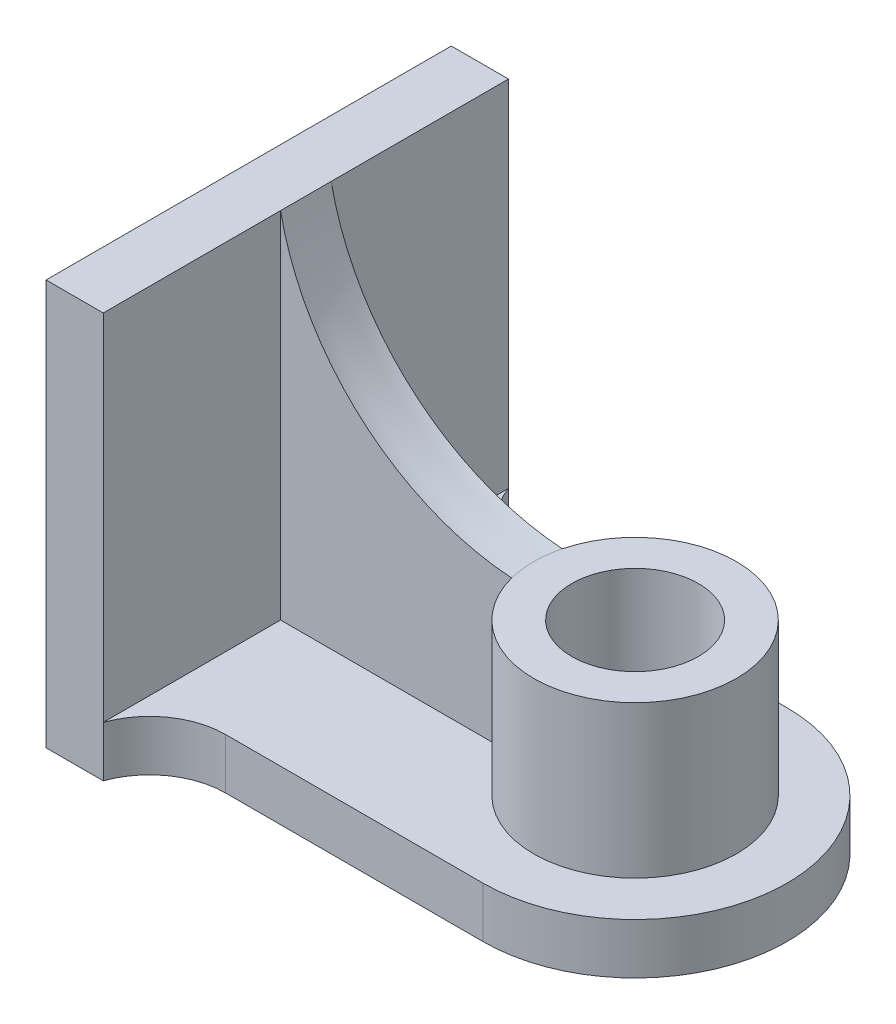
ISO-10303-21;
HEADER;
FILE_DESCRIPTION(('STEP AP214'),'2;1');
FILE_NAME('part.step','',(''),(''),'','','');
FILE_SCHEMA(('AUTOMOTIVE_DESIGN { 1 0 10303 214 1 1 1 1 }'));
ENDSEC;
DATA;
#1=APPLICATION_CONTEXT('core data for automotive mechanical design processes');
#2=APPLICATION_PROTOCOL_DEFINITION('international standard','automotive_design',2000,#1);
#3=PRODUCT_CONTEXT('',#1,'mechanical');
#4=PRODUCT('Part','Part','',(#3));
#5=PRODUCT_RELATED_PRODUCT_CATEGORY('part','',(#4));
#6=PRODUCT_DEFINITION_FORMATION('','',#4);
#7=PRODUCT_DEFINITION_CONTEXT('part definition',#1,'design');
#8=PRODUCT_DEFINITION('design','',#6,#7);
#9=PRODUCT_DEFINITION_SHAPE('','',#8);
#10=(LENGTH_UNIT() NAMED_UNIT(*) SI_UNIT(.MILLI.,.METRE.));
#11=(NAMED_UNIT(*) PLANE_ANGLE_UNIT() SI_UNIT($,.RADIAN.));
#12=(NAMED_UNIT(*) SI_UNIT($,.STERADIAN.) SOLID_ANGLE_UNIT());
#13=UNCERTAINTY_MEASURE_WITH_UNIT(LENGTH_MEASURE(1.E-05),#10,'distance_accuracy_value','');
#14=(GEOMETRIC_REPRESENTATION_CONTEXT(3) GLOBAL_UNCERTAINTY_ASSIGNED_CONTEXT((#13)) GLOBAL_UNIT_ASSIGNED_CONTEXT((#10,
#11,#12)) REPRESENTATION_CONTEXT('',''));
#15=CARTESIAN_POINT('',(0.,0.,0.));
#16=DIRECTION('',(0.,0.,1.));
#17=DIRECTION('',(1.,0.,0.));
#18=AXIS2_PLACEMENT_3D('',#15,#16,#17);
#19=CARTESIAN_POINT('',(0.,0.,0.));
#20=DIRECTION('',(0.,1.,0.));
#21=DIRECTION('',(0.,0.,1.));
#22=AXIS2_PLACEMENT_3D('',#19,#20,#21);
#23=PLANE('',#22);
#24=DIRECTION('',(0.,0.,-1.));
#25=VECTOR('',#24,1.);
#26=CARTESIAN_POINT('',(-65.,0.,0.));
#27=LINE('',#26,#25);
#28=CARTESIAN_POINT('',(-65.,0.,-5.));
#29=VERTEX_POINT('',#28);
#30=CARTESIAN_POINT('',(-65.,0.,-40.));
#31=VERTEX_POINT('',#30);
#32=EDGE_CURVE('E119',#29,#31,#27,.T.);
#33=ORIENTED_EDGE('',*,*,#32,.F.);
#34=DIRECTION('',(1.,0.,0.));
#35=VECTOR('',#34,1.);
#36=CARTESIAN_POINT('',(-19.3649167310371,0.,-5.));
#37=LINE('',#36,#35);
#38=CARTESIAN_POINT('',(-19.3649167310371,0.,-5.));
#39=VERTEX_POINT('',#38);
#40=EDGE_CURVE('E258',#29,#39,#37,.T.);
#41=ORIENTED_EDGE('',*,*,#40,.T.);
#42=CARTESIAN_POINT('',(0.,0.,0.));
#43=DIRECTION('',(0.,1.,0.));
#44=DIRECTION('',(0.,0.,1.));
#45=AXIS2_PLACEMENT_3D('',#42,#43,#44);
#46=CIRCLE('',#45,20.);
#47=CARTESIAN_POINT('',(-19.3649167310371,0.,5.));
#48=VERTEX_POINT('',#47);
#49=EDGE_CURVE('E460',#48,#39,#46,.T.);
#50=ORIENTED_EDGE('',*,*,#49,.F.);
#51=DIRECTION('',(1.,0.,0.));
#52=VECTOR('',#51,1.);
#53=CARTESIAN_POINT('',(-19.3649167310371,0.,5.));
#54=LINE('',#53,#52);
#55=CARTESIAN_POINT('',(-65.,0.,5.));
#56=VERTEX_POINT('',#55);
#57=EDGE_CURVE('E271',#56,#48,#54,.T.);
#58=ORIENTED_EDGE('',*,*,#57,.F.);
#59=CARTESIAN_POINT('',(-65.,0.,40.));
#60=VERTEX_POINT('',#59);
#61=EDGE_CURVE('E245',#60,#56,#27,.T.);
#62=ORIENTED_EDGE('',*,*,#61,.F.);
#63=CARTESIAN_POINT('',(-50.8578643762691,0.,45.));
#64=DIRECTION('',(0.,1.,0.));
#65=DIRECTION('',(0.,0.,1.));
#66=AXIS2_PLACEMENT_3D('',#63,#64,#65);
#67=CIRCLE('',#66,15.);
#68=CARTESIAN_POINT('',(-50.8578643762691,0.,30.));
#69=VERTEX_POINT('',#68);
#70=EDGE_CURVE('E186',#60,#69,#67,.F.);
#71=ORIENTED_EDGE('',*,*,#70,.T.);
#72=DIRECTION('',(-1.,0.,0.));
#73=VECTOR('',#72,1.);
#74=CARTESIAN_POINT('',(0.,0.,30.));
#75=LINE('',#74,#73);
#76=CARTESIAN_POINT('',(0.,0.,30.));
#77=VERTEX_POINT('',#76);
#78=EDGE_CURVE('E190',#77,#69,#75,.T.);
#79=ORIENTED_EDGE('',*,*,#78,.F.);
#80=CARTESIAN_POINT('',(0.,0.,0.));
#81=DIRECTION('',(0.,1.,0.));
#82=DIRECTION('',(0.,0.,1.));
#83=AXIS2_PLACEMENT_3D('',#80,#81,#82);
#84=CIRCLE('',#83,30.);
#85=CARTESIAN_POINT('',(0.,0.,-30.));
#86=VERTEX_POINT('',#85);
#87=EDGE_CURVE('E195',#86,#77,#84,.F.);
#88=ORIENTED_EDGE('',*,*,#87,.F.);
#89=DIRECTION('',(1.,0.,0.));
#90=VECTOR('',#89,1.);
#91=CARTESIAN_POINT('',(0.,0.,-30.));
#92=LINE('',#91,#90);
#93=CARTESIAN_POINT('',(-50.8578643762691,0.,-30.));
#94=VERTEX_POINT('',#93);
#95=EDGE_CURVE('E163',#94,#86,#92,.T.);
#96=ORIENTED_EDGE('',*,*,#95,.F.);
#97=CARTESIAN_POINT('',(-50.8578643762691,0.,-45.));
#98=DIRECTION('',(0.,1.,0.));
#99=DIRECTION('',(0.,0.,1.));
#100=AXIS2_PLACEMENT_3D('',#97,#98,#99);
#101=CIRCLE('',#100,15.);
#102=EDGE_CURVE('E200',#31,#94,#101,.T.);
#103=ORIENTED_EDGE('',*,*,#102,.F.);
#104=EDGE_LOOP('',(#33,#41,#50,#58,#62,#71,#79,#88,#96,#103));
#105=FACE_BOUND('',#104,.T.);
#106=ADVANCED_FACE('F63',(#105),#23,.T.);
#107=CARTESIAN_POINT('',(-65.,70.,0.));
#108=DIRECTION('',(-1.,0.,0.));
#109=DIRECTION('',(0.,0.,1.));
#110=AXIS2_PLACEMENT_3D('',#107,#108,#109);
#111=PLANE('',#110);
#112=DIRECTION('',(0.,-1.,0.));
#113=VECTOR('',#112,1.);
#114=CARTESIAN_POINT('',(-65.,70.,-5.));
#115=LINE('',#114,#113);
#116=CARTESIAN_POINT('',(-65.,70.,-5.));
#117=VERTEX_POINT('',#116);
#118=EDGE_CURVE('E256',#117,#29,#115,.T.);
#119=ORIENTED_EDGE('',*,*,#118,.T.);
#120=ORIENTED_EDGE('',*,*,#32,.T.);
#121=DIRECTION('',(0.,-1.,0.));
#122=VECTOR('',#121,1.);
#123=CARTESIAN_POINT('',(-65.,70.,-40.));
#124=LINE('',#123,#122);
#125=CARTESIAN_POINT('',(-65.,70.,-40.));
#126=VERTEX_POINT('',#125);
#127=EDGE_CURVE('E238',#126,#31,#124,.T.);
#128=ORIENTED_EDGE('',*,*,#127,.F.);
#129=DIRECTION('',(0.,0.,-1.));
#130=VECTOR('',#129,1.);
#131=CARTESIAN_POINT('',(-65.,70.,0.));
#132=LINE('',#131,#130);
#133=EDGE_CURVE('E227',#117,#126,#132,.T.);
#134=ORIENTED_EDGE('',*,*,#133,.F.);
#135=EDGE_LOOP('',(#119,#120,#128,#134));
#136=FACE_BOUND('',#135,.T.);
#137=ADVANCED_FACE('F526',(#136),#111,.F.);
#138=CARTESIAN_POINT('',(0.,-10.,-40.));
#139=DIRECTION('',(0.,0.,-1.));
#140=DIRECTION('',(-1.,0.,0.));
#141=AXIS2_PLACEMENT_3D('',#138,#139,#140);
#142=PLANE('',#141);
#143=DIRECTION('',(0.,1.,0.));
#144=VECTOR('',#143,1.);
#145=CARTESIAN_POINT('',(-76.2928706817788,-10.,-40.));
#146=LINE('',#145,#144);
#147=CARTESIAN_POINT('',(-76.2928706817788,-10.,-40.));
#148=VERTEX_POINT('',#147);
#149=CARTESIAN_POINT('',(-76.2928706817788,70.,-40.));
#150=VERTEX_POINT('',#149);
#151=EDGE_CURVE('E127',#148,#150,#146,.T.);
#152=ORIENTED_EDGE('',*,*,#151,.T.);
#153=DIRECTION('',(-1.,0.,0.));
#154=VECTOR('',#153,1.);
#155=CARTESIAN_POINT('',(0.,70.,-40.));
#156=LINE('',#155,#154);
#157=EDGE_CURVE('E226',#126,#150,#156,.T.);
#158=ORIENTED_EDGE('',*,*,#157,.F.);
#159=ORIENTED_EDGE('',*,*,#127,.T.);
#160=DIRECTION('',(0.,1.,0.));
#161=VECTOR('',#160,1.);
#162=CARTESIAN_POINT('',(-65.,-10.,-40.));
#163=LINE('',#162,#161);
#164=CARTESIAN_POINT('',(-65.,-10.,-40.));
#165=VERTEX_POINT('',#164);
#166=EDGE_CURVE('E12',#165,#31,#163,.T.);
#167=ORIENTED_EDGE('',*,*,#166,.F.);
#168=DIRECTION('',(-1.,0.,0.));
#169=VECTOR('',#168,1.);
#170=CARTESIAN_POINT('',(0.,-10.,-40.));
#171=LINE('',#170,#169);
#172=EDGE_CURVE('E202',#165,#148,#171,.T.);
#173=ORIENTED_EDGE('',*,*,#172,.T.);
#174=EDGE_LOOP('',(#152,#158,#159,#167,#173));
#175=FACE_BOUND('',#174,.T.);
#176=ADVANCED_FACE('F65',(#175),#142,.T.);
#177=CARTESIAN_POINT('',(-50.8578643762691,-10.,-45.));
#178=DIRECTION('',(0.,1.,0.));
#179=DIRECTION('',(0.,0.,1.));
#180=AXIS2_PLACEMENT_3D('',#177,#178,#179);
#181=CYLINDRICAL_SURFACE('',#180,15.);
#182=ORIENTED_EDGE('',*,*,#102,.T.);
#183=DIRECTION('',(0.,1.,0.));
#184=VECTOR('',#183,1.);
#185=CARTESIAN_POINT('',(-50.8578643762691,-10.,-30.));
#186=LINE('',#185,#184);
#187=CARTESIAN_POINT('',(-50.8578643762691,-10.,-30.));
#188=VERTEX_POINT('',#187);
#189=EDGE_CURVE('E74',#188,#94,#186,.T.);
#190=ORIENTED_EDGE('',*,*,#189,.F.);
#191=CARTESIAN_POINT('',(-50.8578643762691,-10.,-45.));
#192=DIRECTION('',(0.,1.,0.));
#193=DIRECTION('',(0.,0.,1.));
#194=AXIS2_PLACEMENT_3D('',#191,#192,#193);
#195=CIRCLE('',#194,15.);
#196=EDGE_CURVE('E153',#165,#188,#195,.T.);
#197=ORIENTED_EDGE('',*,*,#196,.F.);
#198=ORIENTED_EDGE('',*,*,#166,.T.);
#199=EDGE_LOOP('',(#182,#190,#197,#198));
#200=FACE_BOUND('',#199,.T.);
#201=ADVANCED_FACE('F533',(#200),#181,.F.);
#202=CARTESIAN_POINT('',(0.,-10.,-30.));
#203=DIRECTION('',(0.,0.,1.));
#204=DIRECTION('',(1.,0.,0.));
#205=AXIS2_PLACEMENT_3D('',#202,#203,#204);
#206=PLANE('',#205);
#207=ORIENTED_EDGE('',*,*,#95,.T.);
#208=DIRECTION('',(0.,1.,0.));
#209=VECTOR('',#208,1.);
#210=CARTESIAN_POINT('',(0.,-10.,-30.));
#211=LINE('',#210,#209);
#212=CARTESIAN_POINT('',(0.,-10.,-30.));
#213=VERTEX_POINT('',#212);
#214=EDGE_CURVE('E160',#213,#86,#211,.T.);
#215=ORIENTED_EDGE('',*,*,#214,.F.);
#216=DIRECTION('',(1.,0.,0.));
#217=VECTOR('',#216,1.);
#218=CARTESIAN_POINT('',(0.,-10.,-30.));
#219=LINE('',#218,#217);
#220=EDGE_CURVE('E145',#188,#213,#219,.T.);
#221=ORIENTED_EDGE('',*,*,#220,.F.);
#222=ORIENTED_EDGE('',*,*,#189,.T.);
#223=EDGE_LOOP('',(#207,#215,#221,#222));
#224=FACE_BOUND('',#223,.T.);
#225=ADVANCED_FACE('F161',(#224),#206,.F.);
#226=CARTESIAN_POINT('',(0.,-10.,0.));
#227=DIRECTION('',(0.,1.,0.));
#228=DIRECTION('',(0.,0.,1.));
#229=AXIS2_PLACEMENT_3D('',#226,#227,#228);
#230=CYLINDRICAL_SURFACE('',#229,30.);
#231=ORIENTED_EDGE('',*,*,#87,.T.);
#232=DIRECTION('',(0.,1.,0.));
#233=VECTOR('',#232,1.);
#234=CARTESIAN_POINT('',(0.,-10.,30.));
#235=LINE('',#234,#233);
#236=CARTESIAN_POINT('',(0.,-10.,30.));
#237=VERTEX_POINT('',#236);
#238=EDGE_CURVE('E167',#237,#77,#235,.T.);
#239=ORIENTED_EDGE('',*,*,#238,.F.);
#240=CARTESIAN_POINT('',(0.,-10.,0.));
#241=DIRECTION('',(0.,1.,0.));
#242=DIRECTION('',(0.,0.,1.));
#243=AXIS2_PLACEMENT_3D('',#240,#241,#242);
#244=CIRCLE('',#243,30.);
#245=EDGE_CURVE('E151',#213,#237,#244,.F.);
#246=ORIENTED_EDGE('',*,*,#245,.F.);
#247=ORIENTED_EDGE('',*,*,#214,.T.);
#248=EDGE_LOOP('',(#231,#239,#246,#247));
#249=FACE_BOUND('',#248,.T.);
#250=ADVANCED_FACE('F169',(#249),#230,.T.);
#251=CARTESIAN_POINT('',(0.,-10.,30.));
#252=DIRECTION('',(0.,0.,-1.));
#253=DIRECTION('',(-1.,0.,0.));
#254=AXIS2_PLACEMENT_3D('',#251,#252,#253);
#255=PLANE('',#254);
#256=ORIENTED_EDGE('',*,*,#78,.T.);
#257=DIRECTION('',(0.,1.,0.));
#258=VECTOR('',#257,1.);
#259=CARTESIAN_POINT('',(-50.8578643762691,-10.,30.));
#260=LINE('',#259,#258);
#261=CARTESIAN_POINT('',(-50.8578643762691,-10.,30.));
#262=VERTEX_POINT('',#261);
#263=EDGE_CURVE('E208',#262,#69,#260,.T.);
#264=ORIENTED_EDGE('',*,*,#263,.F.);
#265=DIRECTION('',(-1.,0.,0.));
#266=VECTOR('',#265,1.);
#267=CARTESIAN_POINT('',(0.,-10.,30.));
#268=LINE('',#267,#266);
#269=EDGE_CURVE('E173',#237,#262,#268,.T.);
#270=ORIENTED_EDGE('',*,*,#269,.F.);
#271=ORIENTED_EDGE('',*,*,#238,.T.);
#272=EDGE_LOOP('',(#256,#264,#270,#271));
#273=FACE_BOUND('',#272,.T.);
#274=ADVANCED_FACE('F649',(#273),#255,.F.);
#275=CARTESIAN_POINT('',(-50.8578643762691,-10.,45.));
#276=DIRECTION('',(0.,1.,0.));
#277=DIRECTION('',(0.,0.,1.));
#278=AXIS2_PLACEMENT_3D('',#275,#276,#277);
#279=CYLINDRICAL_SURFACE('',#278,15.);
#280=ORIENTED_EDGE('',*,*,#70,.F.);
#281=DIRECTION('',(0.,1.,0.));
#282=VECTOR('',#281,1.);
#283=CARTESIAN_POINT('',(-65.,-10.,40.));
#284=LINE('',#283,#282);
#285=CARTESIAN_POINT('',(-65.,-10.,40.));
#286=VERTEX_POINT('',#285);
#287=EDGE_CURVE('E211',#286,#60,#284,.T.);
#288=ORIENTED_EDGE('',*,*,#287,.F.);
#289=CARTESIAN_POINT('',(-50.8578643762691,-10.,45.));
#290=DIRECTION('',(0.,1.,0.));
#291=DIRECTION('',(0.,0.,1.));
#292=AXIS2_PLACEMENT_3D('',#289,#290,#291);
#293=CIRCLE('',#292,15.);
#294=EDGE_CURVE('E176',#286,#262,#293,.F.);
#295=ORIENTED_EDGE('',*,*,#294,.T.);
#296=ORIENTED_EDGE('',*,*,#263,.T.);
#297=EDGE_LOOP('',(#280,#288,#295,#296));
#298=FACE_BOUND('',#297,.T.);
#299=ADVANCED_FACE('F501',(#298),#279,.F.);
#300=CARTESIAN_POINT('',(0.,-10.,40.));
#301=DIRECTION('',(0.,0.,1.));
#302=DIRECTION('',(1.,0.,0.));
#303=AXIS2_PLACEMENT_3D('',#300,#301,#302);
#304=PLANE('',#303);
#305=ORIENTED_EDGE('',*,*,#287,.T.);
#306=DIRECTION('',(0.,-1.,0.));
#307=VECTOR('',#306,1.);
#308=CARTESIAN_POINT('',(-65.,70.,40.));
#309=LINE('',#308,#307);
#310=CARTESIAN_POINT('',(-65.,70.,40.));
#311=VERTEX_POINT('',#310);
#312=EDGE_CURVE('E477',#311,#60,#309,.T.);
#313=ORIENTED_EDGE('',*,*,#312,.F.);
#314=DIRECTION('',(1.,0.,0.));
#315=VECTOR('',#314,1.);
#316=CARTESIAN_POINT('',(0.,70.,40.));
#317=LINE('',#316,#315);
#318=CARTESIAN_POINT('',(-76.2928706817788,70.,40.));
#319=VERTEX_POINT('',#318);
#320=EDGE_CURVE('E232',#319,#311,#317,.T.);
#321=ORIENTED_EDGE('',*,*,#320,.F.);
#322=DIRECTION('',(0.,1.,0.));
#323=VECTOR('',#322,1.);
#324=CARTESIAN_POINT('',(-76.2928706817788,-10.,40.));
#325=LINE('',#324,#323);
#326=CARTESIAN_POINT('',(-76.2928706817788,-10.,40.));
#327=VERTEX_POINT('',#326);
#328=EDGE_CURVE('E215',#327,#319,#325,.T.);
#329=ORIENTED_EDGE('',*,*,#328,.F.);
#330=DIRECTION('',(1.,0.,0.));
#331=VECTOR('',#330,1.);
#332=CARTESIAN_POINT('',(0.,-10.,40.));
#333=LINE('',#332,#331);
#334=EDGE_CURVE('E493',#327,#286,#333,.T.);
#335=ORIENTED_EDGE('',*,*,#334,.T.);
#336=EDGE_LOOP('',(#305,#313,#321,#329,#335));
#337=FACE_BOUND('',#336,.T.);
#338=ADVANCED_FACE('F505',(#337),#304,.T.);
#339=CARTESIAN_POINT('',(-76.2928706817788,-10.,0.));
#340=DIRECTION('',(-1.,0.,0.));
#341=DIRECTION('',(0.,0.,1.));
#342=AXIS2_PLACEMENT_3D('',#339,#340,#341);
#343=PLANE('',#342);
#344=ORIENTED_EDGE('',*,*,#328,.T.);
#345=DIRECTION('',(0.,0.,1.));
#346=VECTOR('',#345,1.);
#347=CARTESIAN_POINT('',(-76.2928706817788,70.,0.));
#348=LINE('',#347,#346);
#349=EDGE_CURVE('E248',#150,#319,#348,.T.);
#350=ORIENTED_EDGE('',*,*,#349,.F.);
#351=ORIENTED_EDGE('',*,*,#151,.F.);
#352=DIRECTION('',(0.,0.,1.));
#353=VECTOR('',#352,1.);
#354=CARTESIAN_POINT('',(-76.2928706817788,-10.,0.));
#355=LINE('',#354,#353);
#356=EDGE_CURVE('E490',#148,#327,#355,.T.);
#357=ORIENTED_EDGE('',*,*,#356,.T.);
#358=EDGE_LOOP('',(#344,#350,#351,#357));
#359=FACE_BOUND('',#358,.T.);
#360=ADVANCED_FACE('F508',(#359),#343,.T.);
#361=CARTESIAN_POINT('',(0.,-10.,0.));
#362=DIRECTION('',(0.,1.,0.));
#363=DIRECTION('',(0.,0.,1.));
#364=AXIS2_PLACEMENT_3D('',#361,#362,#363);
#365=CYLINDRICAL_SURFACE('',#364,12.5);
#366=CARTESIAN_POINT('',(0.,-10.,0.));
#367=DIRECTION('',(0.,1.,0.));
#368=DIRECTION('',(0.,0.,1.));
#369=AXIS2_PLACEMENT_3D('',#366,#367,#368);
#370=CIRCLE('',#369,12.5);
#371=CARTESIAN_POINT('',(0.,-10.,12.5));
#372=VERTEX_POINT('',#371);
#373=EDGE_CURVE('E182',#372,#372,#370,.T.);
#374=ORIENTED_EDGE('',*,*,#373,.F.);
#375=EDGE_LOOP('',(#374));
#376=FACE_BOUND('',#375,.T.);
#377=CARTESIAN_POINT('',(0.,30.,0.));
#378=DIRECTION('',(0.,1.,0.));
#379=DIRECTION('',(0.,0.,1.));
#380=AXIS2_PLACEMENT_3D('',#377,#378,#379);
#381=CIRCLE('',#380,12.5);
#382=CARTESIAN_POINT('',(0.,30.,12.5));
#383=VERTEX_POINT('',#382);
#384=EDGE_CURVE('E191',#383,#383,#381,.T.);
#385=ORIENTED_EDGE('',*,*,#384,.T.);
#386=EDGE_LOOP('',(#385));
#387=FACE_BOUND('',#386,.T.);
#388=ADVANCED_FACE('F619',(#376,#387),#365,.F.);
#389=CARTESIAN_POINT('',(0.,-10.,0.));
#390=DIRECTION('',(0.,1.,0.));
#391=DIRECTION('',(0.,0.,1.));
#392=AXIS2_PLACEMENT_3D('',#389,#390,#391);
#393=PLANE('',#392);
#394=ORIENTED_EDGE('',*,*,#172,.F.);
#395=ORIENTED_EDGE('',*,*,#196,.T.);
#396=ORIENTED_EDGE('',*,*,#220,.T.);
#397=ORIENTED_EDGE('',*,*,#245,.T.);
#398=ORIENTED_EDGE('',*,*,#269,.T.);
#399=ORIENTED_EDGE('',*,*,#294,.F.);
#400=ORIENTED_EDGE('',*,*,#334,.F.);
#401=ORIENTED_EDGE('',*,*,#356,.F.);
#402=EDGE_LOOP('',(#394,#395,#396,#397,#398,#399,#400,#401));
#403=FACE_BOUND('',#402,.T.);
#404=ORIENTED_EDGE('',*,*,#373,.T.);
#405=EDGE_LOOP('',(#404));
#406=FACE_BOUND('',#405,.T.);
#407=ADVANCED_FACE('F148',(#403,#406),#393,.F.);
#408=CARTESIAN_POINT('',(0.,30.,0.));
#409=DIRECTION('',(0.,-1.,0.));
#410=DIRECTION('',(0.,0.,-1.));
#411=AXIS2_PLACEMENT_3D('',#408,#409,#410);
#412=CYLINDRICAL_SURFACE('',#411,20.);
#413=CARTESIAN_POINT('',(0.,30.,0.));
#414=DIRECTION('',(0.,1.,0.));
#415=DIRECTION('',(0.,0.,1.));
#416=AXIS2_PLACEMENT_3D('',#413,#414,#415);
#417=CIRCLE('',#416,20.);
#418=CARTESIAN_POINT('',(-19.3649167310371,30.,5.));
#419=VERTEX_POINT('',#418);
#420=CARTESIAN_POINT('',(-19.3649167310371,30.,-5.));
#421=VERTEX_POINT('',#420);
#422=EDGE_CURVE('E390',#419,#421,#417,.T.);
#423=ORIENTED_EDGE('',*,*,#422,.F.);
#424=DIRECTION('',(0.,1.,0.));
#425=VECTOR('',#424,1.);
#426=CARTESIAN_POINT('',(-19.3649167310371,30.,5.));
#427=LINE('',#426,#425);
#428=EDGE_CURVE('E276',#48,#419,#427,.T.);
#429=ORIENTED_EDGE('',*,*,#428,.F.);
#430=ORIENTED_EDGE('',*,*,#49,.T.);
#431=DIRECTION('',(0.,1.,0.));
#432=VECTOR('',#431,1.);
#433=CARTESIAN_POINT('',(-19.3649167310371,30.,-5.));
#434=LINE('',#433,#432);
#435=EDGE_CURVE('E67',#39,#421,#434,.T.);
#436=ORIENTED_EDGE('',*,*,#435,.T.);
#437=EDGE_LOOP('',(#423,#429,#430,#436));
#438=FACE_BOUND('',#437,.T.);
#439=ADVANCED_FACE('F412',(#438),#412,.T.);
#440=CARTESIAN_POINT('',(0.,30.,0.));
#441=DIRECTION('',(0.,1.,0.));
#442=DIRECTION('',(0.,0.,1.));
#443=AXIS2_PLACEMENT_3D('',#440,#441,#442);
#444=PLANE('',#443);
#445=CARTESIAN_POINT('',(-19.3649167310371,30.,5.));
#446=CARTESIAN_POINT('',(-19.7883055770124,30.,3.33333333333333));
#447=CARTESIAN_POINT('',(-20.2116944229876,30.,0.));
#448=CARTESIAN_POINT('',(-19.7883055770124,30.,-3.33333333333333));
#449=CARTESIAN_POINT('',(-19.3649167310371,30.,-5.));
#450=B_SPLINE_CURVE_WITH_KNOTS('',3,(#445,#446,#447,#448,#449),.UNSPECIFIED.,.F.,.F.,(4,1,4),
(0.,0.5,1.),.UNSPECIFIED.);
#451=CARTESIAN_POINT('',(-20.,30.,0.));
#452=VERTEX_POINT('',#451);
#453=EDGE_CURVE('E370',#452,#419,#450,.F.);
#454=ORIENTED_EDGE('',*,*,#453,.T.);
#455=ORIENTED_EDGE('',*,*,#422,.T.);
#456=EDGE_CURVE('E358',#421,#452,#450,.F.);
#457=ORIENTED_EDGE('',*,*,#456,.T.);
#458=EDGE_LOOP('',(#454,#455,#457));
#459=FACE_BOUND('',#458,.T.);
#460=ORIENTED_EDGE('',*,*,#384,.F.);
#461=EDGE_LOOP('',(#460));
#462=FACE_BOUND('',#461,.T.);
#463=ADVANCED_FACE('F388',(#459,#462),#444,.T.);
#464=ORIENTED_EDGE('',*,*,#61,.T.);
#465=DIRECTION('',(0.,-1.,0.));
#466=VECTOR('',#465,1.);
#467=CARTESIAN_POINT('',(-65.,70.,5.));
#468=LINE('',#467,#466);
#469=CARTESIAN_POINT('',(-65.,70.,5.));
#470=VERTEX_POINT('',#469);
#471=EDGE_CURVE('E275',#470,#56,#468,.T.);
#472=ORIENTED_EDGE('',*,*,#471,.F.);
#473=EDGE_CURVE('E221',#311,#470,#132,.T.);
#474=ORIENTED_EDGE('',*,*,#473,.F.);
#475=ORIENTED_EDGE('',*,*,#312,.T.);
#476=EDGE_LOOP('',(#464,#472,#474,#475));
#477=FACE_BOUND('',#476,.T.);
#478=ADVANCED_FACE('F411',(#477),#111,.F.);
#479=CARTESIAN_POINT('',(0.,70.,0.));
#480=DIRECTION('',(0.,1.,0.));
#481=DIRECTION('',(0.,0.,1.));
#482=AXIS2_PLACEMENT_3D('',#479,#480,#481);
#483=PLANE('',#482);
#484=ORIENTED_EDGE('',*,*,#349,.T.);
#485=ORIENTED_EDGE('',*,*,#320,.T.);
#486=ORIENTED_EDGE('',*,*,#473,.T.);
#487=DIRECTION('',(0.,0.,-1.));
#488=VECTOR('',#487,1.);
#489=CARTESIAN_POINT('',(-65.,70.,0.));
#490=LINE('',#489,#488);
#491=EDGE_CURVE('E392',#470,#117,#490,.T.);
#492=ORIENTED_EDGE('',*,*,#491,.T.);
#493=ORIENTED_EDGE('',*,*,#133,.T.);
#494=ORIENTED_EDGE('',*,*,#157,.T.);
#495=EDGE_LOOP('',(#484,#485,#486,#492,#493,#494));
#496=FACE_BOUND('',#495,.T.);
#497=ADVANCED_FACE('F343',(#496),#483,.T.);
#498=CARTESIAN_POINT('',(-15.9870263135549,79.8857680739455,-5.));
#499=DIRECTION('',(0.,0.,1.));
#500=DIRECTION('',(1.,0.,0.));
#501=AXIS2_PLACEMENT_3D('',#498,#499,#500);
#502=PLANE('',#501);
#503=CARTESIAN_POINT('',(-15.9870263135549,79.8857680739455,-5.));
#504=DIRECTION('',(0.,0.,-1.));
#505=DIRECTION('',(1.,0.,0.));
#506=AXIS2_PLACEMENT_3D('',#503,#504,#505);
#507=CIRCLE('',#506,50.);
#508=EDGE_CURVE('E82',#421,#117,#507,.T.);
#509=ORIENTED_EDGE('',*,*,#508,.F.);
#510=ORIENTED_EDGE('',*,*,#435,.F.);
#511=ORIENTED_EDGE('',*,*,#40,.F.);
#512=ORIENTED_EDGE('',*,*,#118,.F.);
#513=EDGE_LOOP('',(#509,#510,#511,#512));
#514=FACE_BOUND('',#513,.T.);
#515=ADVANCED_FACE('F309',(#514),#502,.F.);
#516=CARTESIAN_POINT('',(-15.9870263135549,79.8857680739455,5.));
#517=DIRECTION('',(0.,0.,1.));
#518=DIRECTION('',(1.,0.,0.));
#519=AXIS2_PLACEMENT_3D('',#516,#517,#518);
#520=PLANE('',#519);
#521=CARTESIAN_POINT('',(-15.9870263135549,79.8857680739455,5.));
#522=DIRECTION('',(0.,0.,-1.));
#523=DIRECTION('',(1.,0.,0.));
#524=AXIS2_PLACEMENT_3D('',#521,#522,#523);
#525=CIRCLE('',#524,50.);
#526=EDGE_CURVE('E282',#419,#470,#525,.T.);
#527=ORIENTED_EDGE('',*,*,#526,.T.);
#528=ORIENTED_EDGE('',*,*,#471,.T.);
#529=ORIENTED_EDGE('',*,*,#57,.T.);
#530=ORIENTED_EDGE('',*,*,#428,.T.);
#531=EDGE_LOOP('',(#527,#528,#529,#530));
#532=FACE_BOUND('',#531,.T.);
#533=ADVANCED_FACE('F299',(#532),#520,.T.);
#534=CARTESIAN_POINT('',(-65.,70.,5.));
#535=CARTESIAN_POINT('',(-65.,70.,3.33333333333333));
#536=CARTESIAN_POINT('',(-65.,70.,0.));
#537=CARTESIAN_POINT('',(-65.,70.,-3.33333333333333));
#538=CARTESIAN_POINT('',(-65.,70.,-5.));
#539=CARTESIAN_POINT('',(-60.5448758388965,47.9117938389119,5.));
#540=CARTESIAN_POINT('',(-60.6860054542216,47.9117938389119,3.33333333333333));
#541=CARTESIAN_POINT('',(-60.534009345545,48.3373411075445,0.));
#542=CARTESIAN_POINT('',(-60.6860054542216,47.9117938389119,-3.33333333333333));
#543=CARTESIAN_POINT('',(-60.5448758388965,47.9117938389119,-5.));
#544=CARTESIAN_POINT('',(-41.8464567569644,31.5222814352834,5.));
#545=CARTESIAN_POINT('',(-42.1287159876146,31.5222814352834,3.33333333333333));
#546=CARTESIAN_POINT('',(-42.3497965373113,32.0677403779812,0.));
#547=CARTESIAN_POINT('',(-42.1287159876146,31.5222814352834,-3.33333333333333));
#548=CARTESIAN_POINT('',(-41.8464567569644,31.5222814352834,-5.));
#549=CARTESIAN_POINT('',(-19.3649167310371,30.,5.));
#550=CARTESIAN_POINT('',(-19.7883055770124,30.,3.33333333333333));
#551=CARTESIAN_POINT('',(-20.2116944229876,30.,0.));
#552=CARTESIAN_POINT('',(-19.7883055770124,30.,-3.33333333333333));
#553=CARTESIAN_POINT('',(-19.3649167310371,30.,-5.));
#554=B_SPLINE_SURFACE_WITH_KNOTS('',3,3,((#534,#535,#536,#537,#538),(#539,#540,#541,#542,#543),
(#544,#545,#546,#547,#548),(#549,#550,#551,#552,#553)),.UNSPECIFIED.,.F.,.F.,.F.,(4,4),(4,1,4),
(0.,1.),(0.,0.5,1.),.UNSPECIFIED.);
#555=ORIENTED_EDGE('',*,*,#526,.F.);
#556=ORIENTED_EDGE('',*,*,#453,.F.);
#557=ORIENTED_EDGE('',*,*,#456,.F.);
#558=ORIENTED_EDGE('',*,*,#508,.T.);
#559=ORIENTED_EDGE('',*,*,#491,.F.);
#560=EDGE_LOOP('',(#555,#556,#557,#558,#559));
#561=FACE_BOUND('',#560,.T.);
#562=ADVANCED_FACE('F308',(#561),#554,.T.);
#563=CLOSED_SHELL('',(#106,#137,#176,#201,#225,#250,#274,#299,#338,#360,#388,#407,#439,#463,
#478,#497,#515,#533,#562));
#564=MANIFOLD_SOLID_BREP('B2',#563);
#565=ADVANCED_BREP_SHAPE_REPRESENTATION('',(#18,#564),#14);
#566=SHAPE_DEFINITION_REPRESENTATION(#9,#565);
ENDSEC;
END-ISO-10303-21;
